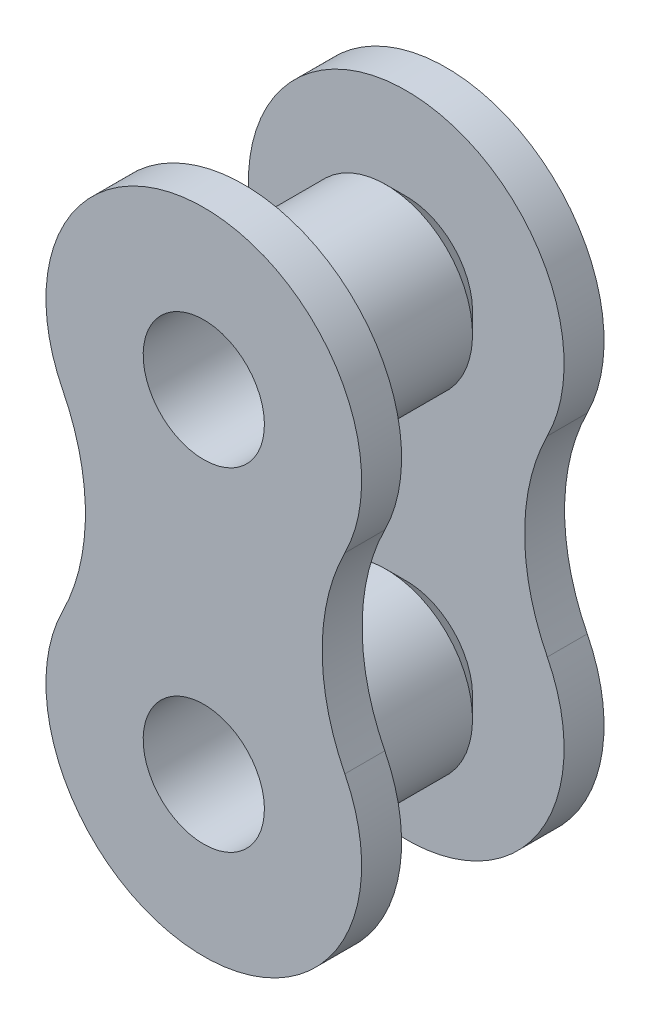
ISO-10303-21;
HEADER;
FILE_DESCRIPTION(('STEP AP214'),'2;1');
FILE_NAME('part.step','',(''),(''),'','','');
FILE_SCHEMA(('AUTOMOTIVE_DESIGN { 1 0 10303 214 1 1 1 1 }'));
ENDSEC;
DATA;
#1=APPLICATION_CONTEXT('core data for automotive mechanical design processes');
#2=APPLICATION_PROTOCOL_DEFINITION('international standard','automotive_design',2000,#1);
#3=PRODUCT_CONTEXT('',#1,'mechanical');
#4=PRODUCT('Part','Part','',(#3));
#5=PRODUCT_RELATED_PRODUCT_CATEGORY('part','',(#4));
#6=PRODUCT_DEFINITION_FORMATION('','',#4);
#7=PRODUCT_DEFINITION_CONTEXT('part definition',#1,'design');
#8=PRODUCT_DEFINITION('design','',#6,#7);
#9=PRODUCT_DEFINITION_SHAPE('','',#8);
#10=(LENGTH_UNIT() NAMED_UNIT(*) SI_UNIT(.MILLI.,.METRE.));
#11=(NAMED_UNIT(*) PLANE_ANGLE_UNIT() SI_UNIT($,.RADIAN.));
#12=(NAMED_UNIT(*) SI_UNIT($,.STERADIAN.) SOLID_ANGLE_UNIT());
#13=UNCERTAINTY_MEASURE_WITH_UNIT(LENGTH_MEASURE(1.E-05),#10,'distance_accuracy_value','');
#14=(GEOMETRIC_REPRESENTATION_CONTEXT(3) GLOBAL_UNCERTAINTY_ASSIGNED_CONTEXT((#13)) GLOBAL_UNIT_ASSIGNED_CONTEXT((#10,
#11,#12)) REPRESENTATION_CONTEXT('',''));
#15=CARTESIAN_POINT('',(0.,0.,0.));
#16=DIRECTION('',(0.,0.,1.));
#17=DIRECTION('',(1.,0.,0.));
#18=AXIS2_PLACEMENT_3D('',#15,#16,#17);
#19=CARTESIAN_POINT('',(133.108700000007,289.100703395233,-128.5494));
#20=DIRECTION('',(0.,0.,-1.));
#21=DIRECTION('',(0.,-1.,0.));
#22=AXIS2_PLACEMENT_3D('',#19,#20,#21);
#23=PLANE('',#22);
#24=CARTESIAN_POINT('',(133.108700000007,292.275703395233,-128.5494));
#25=DIRECTION('',(0.,0.,1.));
#26=DIRECTION('',(0.,-1.,0.));
#27=AXIS2_PLACEMENT_3D('',#24,#25,#26);
#28=CIRCLE('',#27,3.0099);
#29=CARTESIAN_POINT('',(135.798456020965,290.924884918265,-128.5494));
#30=VERTEX_POINT('',#29);
#31=CARTESIAN_POINT('',(130.418943979048,290.924884918265,-128.5494));
#32=VERTEX_POINT('',#31);
#33=EDGE_CURVE('E125',#30,#32,#28,.T.);
#34=ORIENTED_EDGE('',*,*,#33,.T.);
#35=CARTESIAN_POINT('',(126.78662526372,289.100703395233,-128.5494));
#36=DIRECTION('',(0.,0.,1.));
#37=DIRECTION('',(0.,-1.,0.));
#38=AXIS2_PLACEMENT_3D('',#35,#36,#37);
#39=CIRCLE('',#38,4.06464973628698);
#40=CARTESIAN_POINT('',(130.418943979048,287.276521872199,-128.5494));
#41=VERTEX_POINT('',#40);
#42=EDGE_CURVE('E117',#41,#32,#39,.T.);
#43=ORIENTED_EDGE('',*,*,#42,.F.);
#44=CARTESIAN_POINT('',(133.108700000007,285.925703395232,-128.5494));
#45=DIRECTION('',(0.,0.,1.));
#46=DIRECTION('',(0.,-1.,0.));
#47=AXIS2_PLACEMENT_3D('',#44,#45,#46);
#48=CIRCLE('',#47,3.0099);
#49=CARTESIAN_POINT('',(135.798456020965,287.276521872199,-128.5494));
#50=VERTEX_POINT('',#49);
#51=EDGE_CURVE('E102',#41,#50,#48,.T.);
#52=ORIENTED_EDGE('',*,*,#51,.T.);
#53=CARTESIAN_POINT('',(139.430774736293,289.100703395233,-128.5494));
#54=DIRECTION('',(0.,0.,1.));
#55=DIRECTION('',(0.,-1.,0.));
#56=AXIS2_PLACEMENT_3D('',#53,#54,#55);
#57=CIRCLE('',#56,4.06464973628691);
#58=EDGE_CURVE('E26',#30,#50,#57,.T.);
#59=ORIENTED_EDGE('',*,*,#58,.F.);
#60=EDGE_LOOP('',(#34,#43,#52,#59));
#61=FACE_BOUND('',#60,.T.);
#62=CARTESIAN_POINT('',(133.108700000007,285.925703395232,-128.5494));
#63=DIRECTION('',(0.,0.,1.));
#64=DIRECTION('',(0.,-1.,0.));
#65=AXIS2_PLACEMENT_3D('',#62,#63,#64);
#66=CIRCLE('',#65,1.26365);
#67=CARTESIAN_POINT('',(133.108700000007,284.662053395232,-128.5494));
#68=VERTEX_POINT('',#67);
#69=EDGE_CURVE('E184',#68,#68,#66,.T.);
#70=ORIENTED_EDGE('',*,*,#69,.F.);
#71=EDGE_LOOP('',(#70));
#72=FACE_BOUND('',#71,.T.);
#73=CARTESIAN_POINT('',(133.108700000007,292.275703395233,-128.5494));
#74=DIRECTION('',(0.,0.,1.));
#75=DIRECTION('',(0.,-1.,0.));
#76=AXIS2_PLACEMENT_3D('',#73,#74,#75);
#77=CIRCLE('',#76,1.26365);
#78=CARTESIAN_POINT('',(133.108700000007,291.012053395233,-128.5494));
#79=VERTEX_POINT('',#78);
#80=EDGE_CURVE('E183',#79,#79,#77,.T.);
#81=ORIENTED_EDGE('',*,*,#80,.F.);
#82=EDGE_LOOP('',(#81));
#83=FACE_BOUND('',#82,.T.);
#84=ADVANCED_FACE('F17',(#61,#72,#83),#23,.F.);
#85=CARTESIAN_POINT('',(133.108700000007,289.100703395233,-129.3114));
#86=DIRECTION('',(0.,0.,-1.));
#87=DIRECTION('',(0.,-1.,0.));
#88=AXIS2_PLACEMENT_3D('',#85,#86,#87);
#89=PLANE('',#88);
#90=CARTESIAN_POINT('',(133.108700000007,292.275703395233,-129.3114));
#91=DIRECTION('',(0.,0.,1.));
#92=DIRECTION('',(0.,-1.,0.));
#93=AXIS2_PLACEMENT_3D('',#90,#91,#92);
#94=CIRCLE('',#93,1.1557);
#95=CARTESIAN_POINT('',(133.108700000007,291.120003395233,-129.3114));
#96=VERTEX_POINT('',#95);
#97=EDGE_CURVE('E509',#96,#96,#94,.T.);
#98=ORIENTED_EDGE('',*,*,#97,.T.);
#99=EDGE_LOOP('',(#98));
#100=FACE_BOUND('',#99,.T.);
#101=CARTESIAN_POINT('',(133.108700000007,285.925703395232,-129.3114));
#102=DIRECTION('',(0.,0.,1.));
#103=DIRECTION('',(0.,-1.,0.));
#104=AXIS2_PLACEMENT_3D('',#101,#102,#103);
#105=CIRCLE('',#104,1.1557);
#106=CARTESIAN_POINT('',(133.108700000007,284.770003395233,-129.3114));
#107=VERTEX_POINT('',#106);
#108=EDGE_CURVE('E487',#107,#107,#105,.T.);
#109=ORIENTED_EDGE('',*,*,#108,.T.);
#110=EDGE_LOOP('',(#109));
#111=FACE_BOUND('',#110,.T.);
#112=CARTESIAN_POINT('',(133.108700000007,292.275703395233,-129.3114));
#113=DIRECTION('',(0.,0.,1.));
#114=DIRECTION('',(0.,-1.,0.));
#115=AXIS2_PLACEMENT_3D('',#112,#113,#114);
#116=CIRCLE('',#115,3.0099);
#117=CARTESIAN_POINT('',(135.798456020965,290.924884918265,-129.3114));
#118=VERTEX_POINT('',#117);
#119=CARTESIAN_POINT('',(130.418943979048,290.924884918265,-129.3114));
#120=VERTEX_POINT('',#119);
#121=EDGE_CURVE('E135',#118,#120,#116,.T.);
#122=ORIENTED_EDGE('',*,*,#121,.F.);
#123=CARTESIAN_POINT('',(139.430774736293,289.100703395233,-129.3114));
#124=DIRECTION('',(0.,0.,1.));
#125=DIRECTION('',(0.,-1.,0.));
#126=AXIS2_PLACEMENT_3D('',#123,#124,#125);
#127=CIRCLE('',#126,4.06464973628691);
#128=CARTESIAN_POINT('',(135.798456020965,287.276521872199,-129.3114));
#129=VERTEX_POINT('',#128);
#130=EDGE_CURVE('E11',#118,#129,#127,.T.);
#131=ORIENTED_EDGE('',*,*,#130,.T.);
#132=CARTESIAN_POINT('',(133.108700000007,285.925703395232,-129.3114));
#133=DIRECTION('',(0.,0.,1.));
#134=DIRECTION('',(0.,-1.,0.));
#135=AXIS2_PLACEMENT_3D('',#132,#133,#134);
#136=CIRCLE('',#135,3.0099);
#137=CARTESIAN_POINT('',(130.418943979048,287.276521872199,-129.3114));
#138=VERTEX_POINT('',#137);
#139=EDGE_CURVE('E112',#138,#129,#136,.T.);
#140=ORIENTED_EDGE('',*,*,#139,.F.);
#141=CARTESIAN_POINT('',(126.78662526372,289.100703395233,-129.3114));
#142=DIRECTION('',(0.,0.,1.));
#143=DIRECTION('',(0.,-1.,0.));
#144=AXIS2_PLACEMENT_3D('',#141,#142,#143);
#145=CIRCLE('',#144,4.06464973628698);
#146=EDGE_CURVE('E119',#138,#120,#145,.T.);
#147=ORIENTED_EDGE('',*,*,#146,.T.);
#148=EDGE_LOOP('',(#122,#131,#140,#147));
#149=FACE_BOUND('',#148,.T.);
#150=ADVANCED_FACE('F19',(#100,#111,#149),#89,.T.);
#151=CARTESIAN_POINT('',(139.430774736293,289.100703395233,-129.3114));
#152=DIRECTION('',(0.,0.,1.));
#153=DIRECTION('',(0.,1.,0.));
#154=AXIS2_PLACEMENT_3D('',#151,#152,#153);
#155=CYLINDRICAL_SURFACE('',#154,4.06464973628691);
#156=ORIENTED_EDGE('',*,*,#58,.T.);
#157=DIRECTION('',(0.,0.,1.));
#158=VECTOR('',#157,1.);
#159=CARTESIAN_POINT('',(135.798456020965,287.276521872199,-129.3114));
#160=LINE('',#159,#158);
#161=EDGE_CURVE('E108',#129,#50,#160,.T.);
#162=ORIENTED_EDGE('',*,*,#161,.F.);
#163=ORIENTED_EDGE('',*,*,#130,.F.);
#164=DIRECTION('',(0.,0.,1.));
#165=VECTOR('',#164,1.);
#166=CARTESIAN_POINT('',(135.798456020965,290.924884918265,-129.3114));
#167=LINE('',#166,#165);
#168=EDGE_CURVE('E187',#118,#30,#167,.T.);
#169=ORIENTED_EDGE('',*,*,#168,.T.);
#170=EDGE_LOOP('',(#156,#162,#163,#169));
#171=FACE_BOUND('',#170,.T.);
#172=ADVANCED_FACE('F402',(#171),#155,.F.);
#173=CARTESIAN_POINT('',(133.108700000007,285.925703395232,-129.3114));
#174=DIRECTION('',(0.,0.,1.));
#175=DIRECTION('',(0.,1.,0.));
#176=AXIS2_PLACEMENT_3D('',#173,#174,#175);
#177=CYLINDRICAL_SURFACE('',#176,3.0099);
#178=ORIENTED_EDGE('',*,*,#51,.F.);
#179=DIRECTION('',(0.,0.,1.));
#180=VECTOR('',#179,1.);
#181=CARTESIAN_POINT('',(130.418943979048,287.276521872199,-129.3114));
#182=LINE('',#181,#180);
#183=EDGE_CURVE('E106',#138,#41,#182,.T.);
#184=ORIENTED_EDGE('',*,*,#183,.F.);
#185=ORIENTED_EDGE('',*,*,#139,.T.);
#186=ORIENTED_EDGE('',*,*,#161,.T.);
#187=EDGE_LOOP('',(#178,#184,#185,#186));
#188=FACE_BOUND('',#187,.T.);
#189=ADVANCED_FACE('F104',(#188),#177,.T.);
#190=CARTESIAN_POINT('',(126.78662526372,289.100703395233,-129.3114));
#191=DIRECTION('',(0.,0.,1.));
#192=DIRECTION('',(0.,1.,0.));
#193=AXIS2_PLACEMENT_3D('',#190,#191,#192);
#194=CYLINDRICAL_SURFACE('',#193,4.06464973628698);
#195=ORIENTED_EDGE('',*,*,#42,.T.);
#196=DIRECTION('',(0.,0.,1.));
#197=VECTOR('',#196,1.);
#198=CARTESIAN_POINT('',(130.418943979048,290.924884918265,-129.3114));
#199=LINE('',#198,#197);
#200=EDGE_CURVE('E127',#120,#32,#199,.T.);
#201=ORIENTED_EDGE('',*,*,#200,.F.);
#202=ORIENTED_EDGE('',*,*,#146,.F.);
#203=ORIENTED_EDGE('',*,*,#183,.T.);
#204=EDGE_LOOP('',(#195,#201,#202,#203));
#205=FACE_BOUND('',#204,.T.);
#206=ADVANCED_FACE('F115',(#205),#194,.F.);
#207=CARTESIAN_POINT('',(133.108700000007,292.275703395233,-129.3114));
#208=DIRECTION('',(0.,0.,1.));
#209=DIRECTION('',(0.,1.,0.));
#210=AXIS2_PLACEMENT_3D('',#207,#208,#209);
#211=CYLINDRICAL_SURFACE('',#210,3.0099);
#212=ORIENTED_EDGE('',*,*,#33,.F.);
#213=ORIENTED_EDGE('',*,*,#168,.F.);
#214=ORIENTED_EDGE('',*,*,#121,.T.);
#215=ORIENTED_EDGE('',*,*,#200,.T.);
#216=EDGE_LOOP('',(#212,#213,#214,#215));
#217=FACE_BOUND('',#216,.T.);
#218=ADVANCED_FACE('F203',(#217),#211,.T.);
#219=CARTESIAN_POINT('',(133.108700000007,285.925703395232,-128.5494));
#220=DIRECTION('',(0.,0.,1.));
#221=DIRECTION('',(0.,1.,0.));
#222=AXIS2_PLACEMENT_3D('',#219,#220,#221);
#223=CONICAL_SURFACE('',#222,1.26365,0.785398163397448);
#224=ORIENTED_EDGE('',*,*,#69,.T.);
#225=EDGE_LOOP('',(#224));
#226=FACE_BOUND('',#225,.T.);
#227=CARTESIAN_POINT('',(133.108700000007,285.925703395232,-128.16205));
#228=DIRECTION('',(0.,0.,-1.));
#229=DIRECTION('',(0.,-1.,0.));
#230=AXIS2_PLACEMENT_3D('',#227,#228,#229);
#231=CIRCLE('',#230,1.651);
#232=CARTESIAN_POINT('',(133.108700000007,284.274703395232,-128.16205));
#233=VERTEX_POINT('',#232);
#234=EDGE_CURVE('E139',#233,#233,#231,.T.);
#235=ORIENTED_EDGE('',*,*,#234,.T.);
#236=EDGE_LOOP('',(#235));
#237=FACE_BOUND('',#236,.T.);
#238=ADVANCED_FACE('F209',(#226,#237),#223,.T.);
#239=CARTESIAN_POINT('',(133.108700000007,292.275703395233,-128.5494));
#240=DIRECTION('',(0.,0.,1.));
#241=DIRECTION('',(0.,1.,0.));
#242=AXIS2_PLACEMENT_3D('',#239,#240,#241);
#243=CONICAL_SURFACE('',#242,1.26365,0.785398163397448);
#244=ORIENTED_EDGE('',*,*,#80,.T.);
#245=EDGE_LOOP('',(#244));
#246=FACE_BOUND('',#245,.T.);
#247=CARTESIAN_POINT('',(133.108700000007,292.275703395233,-128.16205));
#248=DIRECTION('',(0.,0.,-1.));
#249=DIRECTION('',(0.,-1.,0.));
#250=AXIS2_PLACEMENT_3D('',#247,#248,#249);
#251=CIRCLE('',#250,1.651);
#252=CARTESIAN_POINT('',(133.108700000007,290.624703395232,-128.16205));
#253=VERTEX_POINT('',#252);
#254=EDGE_CURVE('E500',#253,#253,#251,.T.);
#255=ORIENTED_EDGE('',*,*,#254,.T.);
#256=EDGE_LOOP('',(#255));
#257=FACE_BOUND('',#256,.T.);
#258=ADVANCED_FACE('F371',(#246,#257),#243,.T.);
#259=CARTESIAN_POINT('',(133.108700000007,289.100703395233,-125.4506));
#260=DIRECTION('',(0.,0.,1.));
#261=DIRECTION('',(1.,0.,0.));
#262=AXIS2_PLACEMENT_3D('',#259,#260,#261);
#263=PLANE('',#262);
#264=CARTESIAN_POINT('',(133.108700000007,292.275703395233,-125.4506));
#265=DIRECTION('',(0.,0.,1.));
#266=DIRECTION('',(0.,-1.,0.));
#267=AXIS2_PLACEMENT_3D('',#264,#265,#266);
#268=CIRCLE('',#267,3.0099);
#269=CARTESIAN_POINT('',(135.798456020965,290.924884918265,-125.4506));
#270=VERTEX_POINT('',#269);
#271=CARTESIAN_POINT('',(130.418943979048,290.924884918265,-125.4506));
#272=VERTEX_POINT('',#271);
#273=EDGE_CURVE('E143',#270,#272,#268,.T.);
#274=ORIENTED_EDGE('',*,*,#273,.F.);
#275=CARTESIAN_POINT('',(139.430774736293,289.100703395233,-125.4506));
#276=DIRECTION('',(0.,0.,1.));
#277=DIRECTION('',(0.,-1.,0.));
#278=AXIS2_PLACEMENT_3D('',#275,#276,#277);
#279=CIRCLE('',#278,4.06464973628691);
#280=CARTESIAN_POINT('',(135.798456020965,287.276521872199,-125.4506));
#281=VERTEX_POINT('',#280);
#282=EDGE_CURVE('E177',#270,#281,#279,.T.);
#283=ORIENTED_EDGE('',*,*,#282,.T.);
#284=CARTESIAN_POINT('',(133.108700000007,285.925703395232,-125.4506));
#285=DIRECTION('',(0.,0.,1.));
#286=DIRECTION('',(0.,-1.,0.));
#287=AXIS2_PLACEMENT_3D('',#284,#285,#286);
#288=CIRCLE('',#287,3.0099);
#289=CARTESIAN_POINT('',(130.418943979048,287.276521872199,-125.4506));
#290=VERTEX_POINT('',#289);
#291=EDGE_CURVE('E168',#290,#281,#288,.T.);
#292=ORIENTED_EDGE('',*,*,#291,.F.);
#293=CARTESIAN_POINT('',(126.78662526372,289.100703395233,-125.4506));
#294=DIRECTION('',(0.,0.,1.));
#295=DIRECTION('',(0.,-1.,0.));
#296=AXIS2_PLACEMENT_3D('',#293,#294,#295);
#297=CIRCLE('',#296,4.06464973628698);
#298=EDGE_CURVE('E161',#290,#272,#297,.T.);
#299=ORIENTED_EDGE('',*,*,#298,.T.);
#300=EDGE_LOOP('',(#274,#283,#292,#299));
#301=FACE_BOUND('',#300,.T.);
#302=CARTESIAN_POINT('',(133.108700000007,285.925703395232,-125.4506));
#303=DIRECTION('',(0.,0.,1.));
#304=DIRECTION('',(0.,-1.,0.));
#305=AXIS2_PLACEMENT_3D('',#302,#303,#304);
#306=CIRCLE('',#305,1.26365);
#307=CARTESIAN_POINT('',(133.108700000007,284.662053395232,-125.4506));
#308=VERTEX_POINT('',#307);
#309=EDGE_CURVE('E141',#308,#308,#306,.T.);
#310=ORIENTED_EDGE('',*,*,#309,.T.);
#311=EDGE_LOOP('',(#310));
#312=FACE_BOUND('',#311,.T.);
#313=CARTESIAN_POINT('',(133.108700000007,292.275703395233,-125.4506));
#314=DIRECTION('',(0.,0.,1.));
#315=DIRECTION('',(0.,-1.,0.));
#316=AXIS2_PLACEMENT_3D('',#313,#314,#315);
#317=CIRCLE('',#316,1.26365);
#318=CARTESIAN_POINT('',(133.108700000007,291.012053395233,-125.4506));
#319=VERTEX_POINT('',#318);
#320=EDGE_CURVE('E498',#319,#319,#317,.T.);
#321=ORIENTED_EDGE('',*,*,#320,.T.);
#322=EDGE_LOOP('',(#321));
#323=FACE_BOUND('',#322,.T.);
#324=ADVANCED_FACE('F360',(#301,#312,#323),#263,.F.);
#325=CARTESIAN_POINT('',(133.108700000007,289.100703395233,-124.6886));
#326=DIRECTION('',(0.,0.,1.));
#327=DIRECTION('',(1.,0.,0.));
#328=AXIS2_PLACEMENT_3D('',#325,#326,#327);
#329=PLANE('',#328);
#330=CARTESIAN_POINT('',(133.108700000007,292.275703395233,-124.6886));
#331=DIRECTION('',(0.,0.,1.));
#332=DIRECTION('',(0.,-1.,0.));
#333=AXIS2_PLACEMENT_3D('',#330,#331,#332);
#334=CIRCLE('',#333,1.1557);
#335=CARTESIAN_POINT('',(133.108700000007,291.120003395233,-124.6886));
#336=VERTEX_POINT('',#335);
#337=EDGE_CURVE('E512',#336,#336,#334,.T.);
#338=ORIENTED_EDGE('',*,*,#337,.F.);
#339=EDGE_LOOP('',(#338));
#340=FACE_BOUND('',#339,.T.);
#341=CARTESIAN_POINT('',(133.108700000007,285.925703395232,-124.6886));
#342=DIRECTION('',(0.,0.,1.));
#343=DIRECTION('',(0.,-1.,0.));
#344=AXIS2_PLACEMENT_3D('',#341,#342,#343);
#345=CIRCLE('',#344,1.1557);
#346=CARTESIAN_POINT('',(133.108700000007,284.770003395233,-124.6886));
#347=VERTEX_POINT('',#346);
#348=EDGE_CURVE('E493',#347,#347,#345,.T.);
#349=ORIENTED_EDGE('',*,*,#348,.F.);
#350=EDGE_LOOP('',(#349));
#351=FACE_BOUND('',#350,.T.);
#352=CARTESIAN_POINT('',(133.108700000007,292.275703395233,-124.6886));
#353=DIRECTION('',(0.,0.,1.));
#354=DIRECTION('',(0.,-1.,0.));
#355=AXIS2_PLACEMENT_3D('',#352,#353,#354);
#356=CIRCLE('',#355,3.0099);
#357=CARTESIAN_POINT('',(135.798456020965,290.924884918265,-124.6886));
#358=VERTEX_POINT('',#357);
#359=CARTESIAN_POINT('',(130.418943979048,290.924884918265,-124.6886));
#360=VERTEX_POINT('',#359);
#361=EDGE_CURVE('E151',#358,#360,#356,.T.);
#362=ORIENTED_EDGE('',*,*,#361,.T.);
#363=CARTESIAN_POINT('',(126.78662526372,289.100703395233,-124.6886));
#364=DIRECTION('',(0.,0.,1.));
#365=DIRECTION('',(0.,-1.,0.));
#366=AXIS2_PLACEMENT_3D('',#363,#364,#365);
#367=CIRCLE('',#366,4.06464973628698);
#368=CARTESIAN_POINT('',(130.418943979048,287.276521872199,-124.6886));
#369=VERTEX_POINT('',#368);
#370=EDGE_CURVE('E160',#369,#360,#367,.T.);
#371=ORIENTED_EDGE('',*,*,#370,.F.);
#372=CARTESIAN_POINT('',(133.108700000007,285.925703395232,-124.6886));
#373=DIRECTION('',(0.,0.,1.));
#374=DIRECTION('',(0.,-1.,0.));
#375=AXIS2_PLACEMENT_3D('',#372,#373,#374);
#376=CIRCLE('',#375,3.0099);
#377=CARTESIAN_POINT('',(135.798456020965,287.276521872199,-124.6886));
#378=VERTEX_POINT('',#377);
#379=EDGE_CURVE('E173',#369,#378,#376,.T.);
#380=ORIENTED_EDGE('',*,*,#379,.T.);
#381=CARTESIAN_POINT('',(139.430774736293,289.100703395233,-124.6886));
#382=DIRECTION('',(0.,0.,1.));
#383=DIRECTION('',(0.,-1.,0.));
#384=AXIS2_PLACEMENT_3D('',#381,#382,#383);
#385=CIRCLE('',#384,4.06464973628691);
#386=EDGE_CURVE('E180',#358,#378,#385,.T.);
#387=ORIENTED_EDGE('',*,*,#386,.F.);
#388=EDGE_LOOP('',(#362,#371,#380,#387));
#389=FACE_BOUND('',#388,.T.);
#390=ADVANCED_FACE('F340',(#340,#351,#389),#329,.T.);
#391=CARTESIAN_POINT('',(139.430774736293,289.100703395233,-124.6886));
#392=DIRECTION('',(0.,0.,-1.));
#393=DIRECTION('',(0.,1.,0.));
#394=AXIS2_PLACEMENT_3D('',#391,#392,#393);
#395=CYLINDRICAL_SURFACE('',#394,4.06464973628691);
#396=ORIENTED_EDGE('',*,*,#282,.F.);
#397=DIRECTION('',(0.,0.,-1.));
#398=VECTOR('',#397,1.);
#399=CARTESIAN_POINT('',(135.798456020965,290.924884918265,-124.6886));
#400=LINE('',#399,#398);
#401=EDGE_CURVE('E155',#358,#270,#400,.T.);
#402=ORIENTED_EDGE('',*,*,#401,.F.);
#403=ORIENTED_EDGE('',*,*,#386,.T.);
#404=DIRECTION('',(0.,0.,-1.));
#405=VECTOR('',#404,1.);
#406=CARTESIAN_POINT('',(135.798456020965,287.276521872199,-124.6886));
#407=LINE('',#406,#405);
#408=EDGE_CURVE('E169',#378,#281,#407,.T.);
#409=ORIENTED_EDGE('',*,*,#408,.T.);
#410=EDGE_LOOP('',(#396,#402,#403,#409));
#411=FACE_BOUND('',#410,.T.);
#412=ADVANCED_FACE('F226',(#411),#395,.F.);
#413=CARTESIAN_POINT('',(133.108700000007,285.925703395232,-124.6886));
#414=DIRECTION('',(0.,0.,-1.));
#415=DIRECTION('',(0.,1.,0.));
#416=AXIS2_PLACEMENT_3D('',#413,#414,#415);
#417=CYLINDRICAL_SURFACE('',#416,3.0099);
#418=ORIENTED_EDGE('',*,*,#291,.T.);
#419=ORIENTED_EDGE('',*,*,#408,.F.);
#420=ORIENTED_EDGE('',*,*,#379,.F.);
#421=DIRECTION('',(0.,0.,-1.));
#422=VECTOR('',#421,1.);
#423=CARTESIAN_POINT('',(130.418943979048,287.276521872199,-124.6886));
#424=LINE('',#423,#422);
#425=EDGE_CURVE('E156',#369,#290,#424,.T.);
#426=ORIENTED_EDGE('',*,*,#425,.T.);
#427=EDGE_LOOP('',(#418,#419,#420,#426));
#428=FACE_BOUND('',#427,.T.);
#429=ADVANCED_FACE('F220',(#428),#417,.T.);
#430=CARTESIAN_POINT('',(126.78662526372,289.100703395233,-124.6886));
#431=DIRECTION('',(0.,0.,-1.));
#432=DIRECTION('',(0.,1.,0.));
#433=AXIS2_PLACEMENT_3D('',#430,#431,#432);
#434=CYLINDRICAL_SURFACE('',#433,4.06464973628698);
#435=ORIENTED_EDGE('',*,*,#298,.F.);
#436=ORIENTED_EDGE('',*,*,#425,.F.);
#437=ORIENTED_EDGE('',*,*,#370,.T.);
#438=DIRECTION('',(0.,0.,-1.));
#439=VECTOR('',#438,1.);
#440=CARTESIAN_POINT('',(130.418943979048,290.924884918265,-124.6886));
#441=LINE('',#440,#439);
#442=EDGE_CURVE('E147',#360,#272,#441,.T.);
#443=ORIENTED_EDGE('',*,*,#442,.T.);
#444=EDGE_LOOP('',(#435,#436,#437,#443));
#445=FACE_BOUND('',#444,.T.);
#446=ADVANCED_FACE('F225',(#445),#434,.F.);
#447=CARTESIAN_POINT('',(133.108700000007,292.275703395233,-124.6886));
#448=DIRECTION('',(0.,0.,-1.));
#449=DIRECTION('',(0.,1.,0.));
#450=AXIS2_PLACEMENT_3D('',#447,#448,#449);
#451=CYLINDRICAL_SURFACE('',#450,3.0099);
#452=ORIENTED_EDGE('',*,*,#273,.T.);
#453=ORIENTED_EDGE('',*,*,#442,.F.);
#454=ORIENTED_EDGE('',*,*,#361,.F.);
#455=ORIENTED_EDGE('',*,*,#401,.T.);
#456=EDGE_LOOP('',(#452,#453,#454,#455));
#457=FACE_BOUND('',#456,.T.);
#458=ADVANCED_FACE('F283',(#457),#451,.T.);
#459=CARTESIAN_POINT('',(133.108700000007,285.925703395232,-125.4506));
#460=DIRECTION('',(0.,0.,-1.));
#461=DIRECTION('',(0.,1.,0.));
#462=AXIS2_PLACEMENT_3D('',#459,#460,#461);
#463=CONICAL_SURFACE('',#462,1.26365,0.785398163397448);
#464=ORIENTED_EDGE('',*,*,#309,.F.);
#465=EDGE_LOOP('',(#464));
#466=FACE_BOUND('',#465,.T.);
#467=CARTESIAN_POINT('',(133.108700000007,285.925703395232,-125.83795));
#468=DIRECTION('',(0.,0.,-1.));
#469=DIRECTION('',(0.,-1.,0.));
#470=AXIS2_PLACEMENT_3D('',#467,#468,#469);
#471=CIRCLE('',#470,1.651);
#472=CARTESIAN_POINT('',(133.108700000007,284.274703395232,-125.83795));
#473=VERTEX_POINT('',#472);
#474=EDGE_CURVE('E484',#473,#473,#471,.T.);
#475=ORIENTED_EDGE('',*,*,#474,.F.);
#476=EDGE_LOOP('',(#475));
#477=FACE_BOUND('',#476,.T.);
#478=ADVANCED_FACE('F288',(#466,#477),#463,.T.);
#479=CARTESIAN_POINT('',(133.108700000007,285.925703395232,-125.4506));
#480=DIRECTION('',(0.,0.,-1.));
#481=DIRECTION('',(0.,1.,0.));
#482=AXIS2_PLACEMENT_3D('',#479,#480,#481);
#483=CYLINDRICAL_SURFACE('',#482,1.651);
#484=ORIENTED_EDGE('',*,*,#234,.F.);
#485=EDGE_LOOP('',(#484));
#486=FACE_BOUND('',#485,.T.);
#487=ORIENTED_EDGE('',*,*,#474,.T.);
#488=EDGE_LOOP('',(#487));
#489=FACE_BOUND('',#488,.T.);
#490=ADVANCED_FACE('F299',(#486,#489),#483,.T.);
#491=CARTESIAN_POINT('',(133.108700000007,285.925703395232,-125.4506));
#492=DIRECTION('',(0.,0.,-1.));
#493=DIRECTION('',(0.,1.,0.));
#494=AXIS2_PLACEMENT_3D('',#491,#492,#493);
#495=CYLINDRICAL_SURFACE('',#494,1.1557);
#496=ORIENTED_EDGE('',*,*,#108,.F.);
#497=EDGE_LOOP('',(#496));
#498=FACE_BOUND('',#497,.T.);
#499=ORIENTED_EDGE('',*,*,#348,.T.);
#500=EDGE_LOOP('',(#499));
#501=FACE_BOUND('',#500,.T.);
#502=ADVANCED_FACE('F264',(#498,#501),#495,.F.);
#503=CARTESIAN_POINT('',(133.108700000007,292.275703395233,-125.4506));
#504=DIRECTION('',(0.,0.,-1.));
#505=DIRECTION('',(0.,1.,0.));
#506=AXIS2_PLACEMENT_3D('',#503,#504,#505);
#507=CONICAL_SURFACE('',#506,1.26365,0.785398163397448);
#508=ORIENTED_EDGE('',*,*,#320,.F.);
#509=EDGE_LOOP('',(#508));
#510=FACE_BOUND('',#509,.T.);
#511=CARTESIAN_POINT('',(133.108700000007,292.275703395233,-125.83795));
#512=DIRECTION('',(0.,0.,-1.));
#513=DIRECTION('',(0.,-1.,0.));
#514=AXIS2_PLACEMENT_3D('',#511,#512,#513);
#515=CIRCLE('',#514,1.651);
#516=CARTESIAN_POINT('',(133.108700000007,290.624703395232,-125.83795));
#517=VERTEX_POINT('',#516);
#518=EDGE_CURVE('E506',#517,#517,#515,.T.);
#519=ORIENTED_EDGE('',*,*,#518,.F.);
#520=EDGE_LOOP('',(#519));
#521=FACE_BOUND('',#520,.T.);
#522=ADVANCED_FACE('F252',(#510,#521),#507,.T.);
#523=CARTESIAN_POINT('',(133.108700000007,292.275703395233,-125.4506));
#524=DIRECTION('',(0.,0.,-1.));
#525=DIRECTION('',(0.,1.,0.));
#526=AXIS2_PLACEMENT_3D('',#523,#524,#525);
#527=CYLINDRICAL_SURFACE('',#526,1.651);
#528=ORIENTED_EDGE('',*,*,#254,.F.);
#529=EDGE_LOOP('',(#528));
#530=FACE_BOUND('',#529,.T.);
#531=ORIENTED_EDGE('',*,*,#518,.T.);
#532=EDGE_LOOP('',(#531));
#533=FACE_BOUND('',#532,.T.);
#534=ADVANCED_FACE('F240',(#530,#533),#527,.T.);
#535=CARTESIAN_POINT('',(133.108700000007,292.275703395233,-125.4506));
#536=DIRECTION('',(0.,0.,-1.));
#537=DIRECTION('',(0.,1.,0.));
#538=AXIS2_PLACEMENT_3D('',#535,#536,#537);
#539=CYLINDRICAL_SURFACE('',#538,1.1557);
#540=ORIENTED_EDGE('',*,*,#97,.F.);
#541=EDGE_LOOP('',(#540));
#542=FACE_BOUND('',#541,.T.);
#543=ORIENTED_EDGE('',*,*,#337,.T.);
#544=EDGE_LOOP('',(#543));
#545=FACE_BOUND('',#544,.T.);
#546=ADVANCED_FACE('F235',(#542,#545),#539,.F.);
#547=CLOSED_SHELL('',(#84,#150,#172,#189,#206,#218,#238,#258,#324,#390,#412,#429,#446,#458,#478,
#490,#502,#522,#534,#546));
#548=MANIFOLD_SOLID_BREP('B1',#547);
#549=ADVANCED_BREP_SHAPE_REPRESENTATION('',(#18,#548),#14);
#550=SHAPE_DEFINITION_REPRESENTATION(#9,#549);
ENDSEC;
END-ISO-10303-21;
